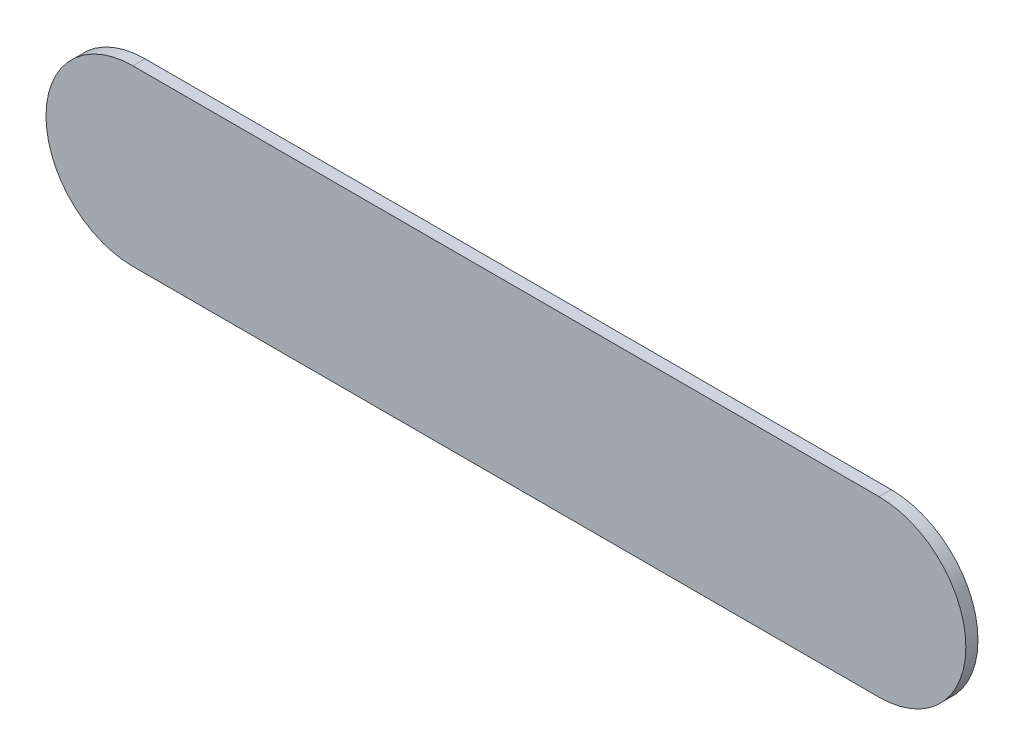
ISO-10303-21;
HEADER;
FILE_DESCRIPTION(('STEP AP214'),'2;1');
FILE_NAME('part.step','',(''),(''),'','','');
FILE_SCHEMA(('AUTOMOTIVE_DESIGN { 1 0 10303 214 1 1 1 1 }'));
ENDSEC;
DATA;
#1=APPLICATION_CONTEXT('core data for automotive mechanical design processes');
#2=APPLICATION_PROTOCOL_DEFINITION('international standard','automotive_design',2000,#1);
#3=PRODUCT_CONTEXT('',#1,'mechanical');
#4=PRODUCT('Part','Part','',(#3));
#5=PRODUCT_RELATED_PRODUCT_CATEGORY('part','',(#4));
#6=PRODUCT_DEFINITION_FORMATION('','',#4);
#7=PRODUCT_DEFINITION_CONTEXT('part definition',#1,'design');
#8=PRODUCT_DEFINITION('design','',#6,#7);
#9=PRODUCT_DEFINITION_SHAPE('','',#8);
#10=(LENGTH_UNIT() NAMED_UNIT(*) SI_UNIT(.MILLI.,.METRE.));
#11=(NAMED_UNIT(*) PLANE_ANGLE_UNIT() SI_UNIT($,.RADIAN.));
#12=(NAMED_UNIT(*) SI_UNIT($,.STERADIAN.) SOLID_ANGLE_UNIT());
#13=UNCERTAINTY_MEASURE_WITH_UNIT(LENGTH_MEASURE(1.E-05),#10,'distance_accuracy_value','');
#14=(GEOMETRIC_REPRESENTATION_CONTEXT(3) GLOBAL_UNCERTAINTY_ASSIGNED_CONTEXT((#13)) GLOBAL_UNIT_ASSIGNED_CONTEXT((#10,
#11,#12)) REPRESENTATION_CONTEXT('',''));
#15=CARTESIAN_POINT('',(0.,0.,0.));
#16=DIRECTION('',(0.,0.,1.));
#17=DIRECTION('',(1.,0.,0.));
#18=AXIS2_PLACEMENT_3D('',#15,#16,#17);
#19=CARTESIAN_POINT('',(113.157,-118.283,1.635));
#20=DIRECTION('',(0.,0.,1.));
#21=DIRECTION('',(1.,0.,0.));
#22=AXIS2_PLACEMENT_3D('',#19,#20,#21);
#23=PLANE('',#22);
#24=DIRECTION('',(1.,0.,0.));
#25=VECTOR('',#24,1.);
#26=CARTESIAN_POINT('',(113.157,-118.283,1.635));
#27=LINE('',#26,#25);
#28=CARTESIAN_POINT('',(113.157,-118.283,1.635));
#29=VERTEX_POINT('',#28);
#30=CARTESIAN_POINT('',(115.304,-118.283,1.635));
#31=VERTEX_POINT('',#30);
#32=EDGE_CURVE('E81',#29,#31,#27,.T.);
#33=ORIENTED_EDGE('',*,*,#32,.T.);
#34=CARTESIAN_POINT('',(115.304,-118.033,1.635));
#35=DIRECTION('',(0.,0.,1.));
#36=DIRECTION('',(0.,-1.,0.));
#37=AXIS2_PLACEMENT_3D('',#34,#35,#36);
#38=CIRCLE('',#37,0.25);
#39=CARTESIAN_POINT('',(115.304,-117.783,1.635));
#40=VERTEX_POINT('',#39);
#41=EDGE_CURVE('E97',#31,#40,#38,.T.);
#42=ORIENTED_EDGE('',*,*,#41,.T.);
#43=DIRECTION('',(-1.,0.,0.));
#44=VECTOR('',#43,1.);
#45=CARTESIAN_POINT('',(115.304,-117.783,1.635));
#46=LINE('',#45,#44);
#47=CARTESIAN_POINT('',(113.157,-117.783,1.635));
#48=VERTEX_POINT('',#47);
#49=EDGE_CURVE('E74',#40,#48,#46,.T.);
#50=ORIENTED_EDGE('',*,*,#49,.T.);
#51=CARTESIAN_POINT('',(113.157,-118.033,1.635));
#52=DIRECTION('',(0.,0.,1.));
#53=DIRECTION('',(0.,1.,0.));
#54=AXIS2_PLACEMENT_3D('',#51,#52,#53);
#55=CIRCLE('',#54,0.25);
#56=EDGE_CURVE('E11',#48,#29,#55,.T.);
#57=ORIENTED_EDGE('',*,*,#56,.T.);
#58=EDGE_LOOP('',(#33,#42,#50,#57));
#59=FACE_BOUND('',#58,.T.);
#60=ADVANCED_FACE('F17',(#59),#23,.T.);
#61=CARTESIAN_POINT('',(113.157,-118.283,1.6));
#62=DIRECTION('',(0.,0.,1.));
#63=DIRECTION('',(1.,0.,0.));
#64=AXIS2_PLACEMENT_3D('',#61,#62,#63);
#65=PLANE('',#64);
#66=CARTESIAN_POINT('',(113.157,-118.033,1.6));
#67=DIRECTION('',(0.,0.,1.));
#68=DIRECTION('',(0.,1.,0.));
#69=AXIS2_PLACEMENT_3D('',#66,#67,#68);
#70=CIRCLE('',#69,0.25);
#71=CARTESIAN_POINT('',(113.157,-117.783,1.6));
#72=VERTEX_POINT('',#71);
#73=CARTESIAN_POINT('',(113.157,-118.283,1.6));
#74=VERTEX_POINT('',#73);
#75=EDGE_CURVE('E25',#72,#74,#70,.T.);
#76=ORIENTED_EDGE('',*,*,#75,.F.);
#77=DIRECTION('',(-1.,0.,0.));
#78=VECTOR('',#77,1.);
#79=CARTESIAN_POINT('',(115.304,-117.783,1.6));
#80=LINE('',#79,#78);
#81=CARTESIAN_POINT('',(115.304,-117.783,1.6));
#82=VERTEX_POINT('',#81);
#83=EDGE_CURVE('E100',#82,#72,#80,.T.);
#84=ORIENTED_EDGE('',*,*,#83,.F.);
#85=CARTESIAN_POINT('',(115.304,-118.033,1.6));
#86=DIRECTION('',(0.,0.,1.));
#87=DIRECTION('',(0.,-1.,0.));
#88=AXIS2_PLACEMENT_3D('',#85,#86,#87);
#89=CIRCLE('',#88,0.25);
#90=CARTESIAN_POINT('',(115.304,-118.283,1.6));
#91=VERTEX_POINT('',#90);
#92=EDGE_CURVE('E83',#91,#82,#89,.T.);
#93=ORIENTED_EDGE('',*,*,#92,.F.);
#94=DIRECTION('',(1.,0.,0.));
#95=VECTOR('',#94,1.);
#96=CARTESIAN_POINT('',(113.157,-118.283,1.6));
#97=LINE('',#96,#95);
#98=EDGE_CURVE('E79',#74,#91,#97,.T.);
#99=ORIENTED_EDGE('',*,*,#98,.F.);
#100=EDGE_LOOP('',(#76,#84,#93,#99));
#101=FACE_BOUND('',#100,.T.);
#102=ADVANCED_FACE('F85',(#101),#65,.F.);
#103=CARTESIAN_POINT('',(113.157,-118.033,1.6));
#104=DIRECTION('',(0.,0.,-1.));
#105=DIRECTION('',(0.,1.,0.));
#106=AXIS2_PLACEMENT_3D('',#103,#104,#105);
#107=CYLINDRICAL_SURFACE('',#106,0.25);
#108=ORIENTED_EDGE('',*,*,#75,.T.);
#109=DIRECTION('',(0.,0.,1.));
#110=VECTOR('',#109,1.);
#111=CARTESIAN_POINT('',(113.157,-118.283,1.6));
#112=LINE('',#111,#110);
#113=EDGE_CURVE('E68',#74,#29,#112,.T.);
#114=ORIENTED_EDGE('',*,*,#113,.T.);
#115=ORIENTED_EDGE('',*,*,#56,.F.);
#116=DIRECTION('',(0.,0.,1.));
#117=VECTOR('',#116,1.);
#118=CARTESIAN_POINT('',(113.157,-117.783,1.6));
#119=LINE('',#118,#117);
#120=EDGE_CURVE('E71',#72,#48,#119,.T.);
#121=ORIENTED_EDGE('',*,*,#120,.F.);
#122=EDGE_LOOP('',(#108,#114,#115,#121));
#123=FACE_BOUND('',#122,.T.);
#124=ADVANCED_FACE('F67',(#123),#107,.T.);
#125=CARTESIAN_POINT('',(115.304,-117.783,1.6));
#126=DIRECTION('',(0.,-1.,0.));
#127=DIRECTION('',(0.,0.,-1.));
#128=AXIS2_PLACEMENT_3D('',#125,#126,#127);
#129=PLANE('',#128);
#130=ORIENTED_EDGE('',*,*,#83,.T.);
#131=ORIENTED_EDGE('',*,*,#120,.T.);
#132=ORIENTED_EDGE('',*,*,#49,.F.);
#133=DIRECTION('',(0.,0.,1.));
#134=VECTOR('',#133,1.);
#135=CARTESIAN_POINT('',(115.304,-117.783,1.6));
#136=LINE('',#135,#134);
#137=EDGE_CURVE('E101',#82,#40,#136,.T.);
#138=ORIENTED_EDGE('',*,*,#137,.F.);
#139=EDGE_LOOP('',(#130,#131,#132,#138));
#140=FACE_BOUND('',#139,.T.);
#141=ADVANCED_FACE('F118',(#140),#129,.F.);
#142=CARTESIAN_POINT('',(115.304,-118.033,1.6));
#143=DIRECTION('',(0.,0.,-1.));
#144=DIRECTION('',(0.,-1.,0.));
#145=AXIS2_PLACEMENT_3D('',#142,#143,#144);
#146=CYLINDRICAL_SURFACE('',#145,0.25);
#147=ORIENTED_EDGE('',*,*,#92,.T.);
#148=ORIENTED_EDGE('',*,*,#137,.T.);
#149=ORIENTED_EDGE('',*,*,#41,.F.);
#150=DIRECTION('',(0.,0.,1.));
#151=VECTOR('',#150,1.);
#152=CARTESIAN_POINT('',(115.304,-118.283,1.6));
#153=LINE('',#152,#151);
#154=EDGE_CURVE('E89',#91,#31,#153,.T.);
#155=ORIENTED_EDGE('',*,*,#154,.F.);
#156=EDGE_LOOP('',(#147,#148,#149,#155));
#157=FACE_BOUND('',#156,.T.);
#158=ADVANCED_FACE('F121',(#157),#146,.T.);
#159=CARTESIAN_POINT('',(113.157,-118.283,1.6));
#160=DIRECTION('',(0.,1.,0.));
#161=DIRECTION('',(1.,0.,0.));
#162=AXIS2_PLACEMENT_3D('',#159,#160,#161);
#163=PLANE('',#162);
#164=ORIENTED_EDGE('',*,*,#98,.T.);
#165=ORIENTED_EDGE('',*,*,#154,.T.);
#166=ORIENTED_EDGE('',*,*,#32,.F.);
#167=ORIENTED_EDGE('',*,*,#113,.F.);
#168=EDGE_LOOP('',(#164,#165,#166,#167));
#169=FACE_BOUND('',#168,.T.);
#170=ADVANCED_FACE('F77',(#169),#163,.F.);
#171=CLOSED_SHELL('',(#60,#102,#124,#141,#158,#170));
#172=MANIFOLD_SOLID_BREP('B1',#171);
#173=ADVANCED_BREP_SHAPE_REPRESENTATION('',(#18,#172),#14);
#174=SHAPE_DEFINITION_REPRESENTATION(#9,#173);
ENDSEC;
END-ISO-10303-21;
